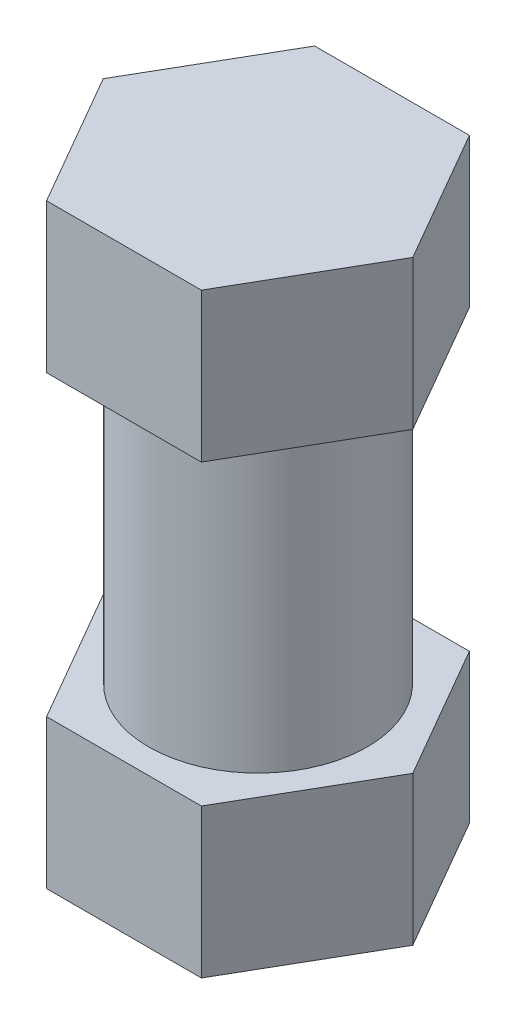
ISO-10303-21;
HEADER;
FILE_DESCRIPTION(('STEP AP214'),'2;1');
FILE_NAME('part.step','',(''),(''),'','','');
FILE_SCHEMA(('AUTOMOTIVE_DESIGN { 1 0 10303 214 1 1 1 1 }'));
ENDSEC;
DATA;
#1=APPLICATION_CONTEXT('core data for automotive mechanical design processes');
#2=APPLICATION_PROTOCOL_DEFINITION('international standard','automotive_design',2000,#1);
#3=PRODUCT_CONTEXT('',#1,'mechanical');
#4=PRODUCT('Part','Part','',(#3));
#5=PRODUCT_RELATED_PRODUCT_CATEGORY('part','',(#4));
#6=PRODUCT_DEFINITION_FORMATION('','',#4);
#7=PRODUCT_DEFINITION_CONTEXT('part definition',#1,'design');
#8=PRODUCT_DEFINITION('design','',#6,#7);
#9=PRODUCT_DEFINITION_SHAPE('','',#8);
#10=(LENGTH_UNIT() NAMED_UNIT(*) SI_UNIT(.MILLI.,.METRE.));
#11=(NAMED_UNIT(*) PLANE_ANGLE_UNIT() SI_UNIT($,.RADIAN.));
#12=(NAMED_UNIT(*) SI_UNIT($,.STERADIAN.) SOLID_ANGLE_UNIT());
#13=UNCERTAINTY_MEASURE_WITH_UNIT(LENGTH_MEASURE(1.E-05),#10,'distance_accuracy_value','');
#14=(GEOMETRIC_REPRESENTATION_CONTEXT(3) GLOBAL_UNCERTAINTY_ASSIGNED_CONTEXT((#13)) GLOBAL_UNIT_ASSIGNED_CONTEXT((#10,
#11,#12)) REPRESENTATION_CONTEXT('',''));
#15=CARTESIAN_POINT('',(0.,0.,0.));
#16=DIRECTION('',(0.,0.,1.));
#17=DIRECTION('',(1.,0.,0.));
#18=AXIS2_PLACEMENT_3D('',#15,#16,#17);
#19=CARTESIAN_POINT('',(0.,3.,0.));
#20=DIRECTION('',(0.,-1.,0.));
#21=DIRECTION('',(0.,0.,-1.));
#22=AXIS2_PLACEMENT_3D('',#19,#20,#21);
#23=CYLINDRICAL_SURFACE('',#22,2.2);
#24=CARTESIAN_POINT('',(0.,3.,0.));
#25=DIRECTION('',(0.,1.,0.));
#26=DIRECTION('',(0.,0.,1.));
#27=AXIS2_PLACEMENT_3D('',#24,#25,#26);
#28=CIRCLE('',#27,2.2);
#29=CARTESIAN_POINT('',(0.,3.,2.2));
#30=VERTEX_POINT('',#29);
#31=EDGE_CURVE('E11',#30,#30,#28,.T.);
#32=ORIENTED_EDGE('',*,*,#31,.F.);
#33=EDGE_LOOP('',(#32));
#34=FACE_BOUND('',#33,.T.);
#35=CARTESIAN_POINT('',(0.,-3.,0.));
#36=DIRECTION('',(0.,1.,0.));
#37=DIRECTION('',(0.,0.,1.));
#38=AXIS2_PLACEMENT_3D('',#35,#36,#37);
#39=CIRCLE('',#38,2.2);
#40=CARTESIAN_POINT('',(0.,-3.,2.2));
#41=VERTEX_POINT('',#40);
#42=EDGE_CURVE('E132',#41,#41,#39,.T.);
#43=ORIENTED_EDGE('',*,*,#42,.T.);
#44=EDGE_LOOP('',(#43));
#45=FACE_BOUND('',#44,.T.);
#46=ADVANCED_FACE('F39',(#34,#45),#23,.T.);
#47=CARTESIAN_POINT('',(1.55884572681199,6.,-2.7));
#48=DIRECTION('',(0.,0.,1.));
#49=DIRECTION('',(1.,0.,0.));
#50=AXIS2_PLACEMENT_3D('',#47,#48,#49);
#51=PLANE('',#50);
#52=DIRECTION('',(-1.,0.,0.));
#53=VECTOR('',#52,1.);
#54=CARTESIAN_POINT('',(1.55884572681199,3.,-2.7));
#55=LINE('',#54,#53);
#56=CARTESIAN_POINT('',(1.55884572681199,3.,-2.7));
#57=VERTEX_POINT('',#56);
#58=CARTESIAN_POINT('',(-1.55884572681199,3.,-2.7));
#59=VERTEX_POINT('',#58);
#60=EDGE_CURVE('E128',#57,#59,#55,.T.);
#61=ORIENTED_EDGE('',*,*,#60,.T.);
#62=DIRECTION('',(0.,-1.,0.));
#63=VECTOR('',#62,1.);
#64=CARTESIAN_POINT('',(-1.55884572681199,6.,-2.7));
#65=LINE('',#64,#63);
#66=CARTESIAN_POINT('',(-1.55884572681199,6.,-2.7));
#67=VERTEX_POINT('',#66);
#68=EDGE_CURVE('E47',#67,#59,#65,.T.);
#69=ORIENTED_EDGE('',*,*,#68,.F.);
#70=DIRECTION('',(-1.,0.,0.));
#71=VECTOR('',#70,1.);
#72=CARTESIAN_POINT('',(1.55884572681199,6.,-2.7));
#73=LINE('',#72,#71);
#74=CARTESIAN_POINT('',(1.55884572681199,6.,-2.7));
#75=VERTEX_POINT('',#74);
#76=EDGE_CURVE('E139',#75,#67,#73,.T.);
#77=ORIENTED_EDGE('',*,*,#76,.F.);
#78=DIRECTION('',(0.,-1.,0.));
#79=VECTOR('',#78,1.);
#80=CARTESIAN_POINT('',(1.55884572681199,6.,-2.7));
#81=LINE('',#80,#79);
#82=EDGE_CURVE('E124',#75,#57,#81,.T.);
#83=ORIENTED_EDGE('',*,*,#82,.T.);
#84=EDGE_LOOP('',(#61,#69,#77,#83));
#85=FACE_BOUND('',#84,.T.);
#86=ADVANCED_FACE('F150',(#85),#51,.F.);
#87=CARTESIAN_POINT('',(-1.55884572681199,6.,-2.7));
#88=DIRECTION('',(0.866025403784439,0.,0.5));
#89=DIRECTION('',(0.5,0.,-0.866025403784439));
#90=AXIS2_PLACEMENT_3D('',#87,#88,#89);
#91=PLANE('',#90);
#92=DIRECTION('',(-0.5,0.,0.866025403784439));
#93=VECTOR('',#92,1.);
#94=CARTESIAN_POINT('',(-1.55884572681199,3.,-2.7));
#95=LINE('',#94,#93);
#96=CARTESIAN_POINT('',(-3.11769145362398,3.,0.));
#97=VERTEX_POINT('',#96);
#98=EDGE_CURVE('E131',#59,#97,#95,.T.);
#99=ORIENTED_EDGE('',*,*,#98,.T.);
#100=DIRECTION('',(0.,-1.,0.));
#101=VECTOR('',#100,1.);
#102=CARTESIAN_POINT('',(-3.11769145362398,6.,0.));
#103=LINE('',#102,#101);
#104=CARTESIAN_POINT('',(-3.11769145362398,6.,0.));
#105=VERTEX_POINT('',#104);
#106=EDGE_CURVE('E143',#105,#97,#103,.T.);
#107=ORIENTED_EDGE('',*,*,#106,.F.);
#108=DIRECTION('',(-0.5,0.,0.866025403784439));
#109=VECTOR('',#108,1.);
#110=CARTESIAN_POINT('',(-1.55884572681199,6.,-2.7));
#111=LINE('',#110,#109);
#112=EDGE_CURVE('E94',#67,#105,#111,.T.);
#113=ORIENTED_EDGE('',*,*,#112,.F.);
#114=ORIENTED_EDGE('',*,*,#68,.T.);
#115=EDGE_LOOP('',(#99,#107,#113,#114));
#116=FACE_BOUND('',#115,.T.);
#117=ADVANCED_FACE('F146',(#116),#91,.F.);
#118=CARTESIAN_POINT('',(-3.11769145362398,6.,0.));
#119=DIRECTION('',(0.866025403784439,0.,-0.5));
#120=DIRECTION('',(-0.5,0.,-0.866025403784439));
#121=AXIS2_PLACEMENT_3D('',#118,#119,#120);
#122=PLANE('',#121);
#123=DIRECTION('',(0.5,0.,0.866025403784439));
#124=VECTOR('',#123,1.);
#125=CARTESIAN_POINT('',(-3.11769145362398,3.,0.));
#126=LINE('',#125,#124);
#127=CARTESIAN_POINT('',(-1.55884572681199,3.,2.7));
#128=VERTEX_POINT('',#127);
#129=EDGE_CURVE('E134',#97,#128,#126,.T.);
#130=ORIENTED_EDGE('',*,*,#129,.T.);
#131=DIRECTION('',(0.,-1.,0.));
#132=VECTOR('',#131,1.);
#133=CARTESIAN_POINT('',(-1.55884572681199,6.,2.7));
#134=LINE('',#133,#132);
#135=CARTESIAN_POINT('',(-1.55884572681199,6.,2.7));
#136=VERTEX_POINT('',#135);
#137=EDGE_CURVE('E119',#136,#128,#134,.T.);
#138=ORIENTED_EDGE('',*,*,#137,.F.);
#139=DIRECTION('',(0.5,0.,0.866025403784439));
#140=VECTOR('',#139,1.);
#141=CARTESIAN_POINT('',(-3.11769145362398,6.,0.));
#142=LINE('',#141,#140);
#143=EDGE_CURVE('E110',#105,#136,#142,.T.);
#144=ORIENTED_EDGE('',*,*,#143,.F.);
#145=ORIENTED_EDGE('',*,*,#106,.T.);
#146=EDGE_LOOP('',(#130,#138,#144,#145));
#147=FACE_BOUND('',#146,.T.);
#148=ADVANCED_FACE('F155',(#147),#122,.F.);
#149=CARTESIAN_POINT('',(-1.55884572681199,6.,2.7));
#150=DIRECTION('',(0.,0.,-1.));
#151=DIRECTION('',(-1.,0.,0.));
#152=AXIS2_PLACEMENT_3D('',#149,#150,#151);
#153=PLANE('',#152);
#154=DIRECTION('',(1.,0.,0.));
#155=VECTOR('',#154,1.);
#156=CARTESIAN_POINT('',(-1.55884572681199,3.,2.7));
#157=LINE('',#156,#155);
#158=CARTESIAN_POINT('',(1.55884572681199,3.,2.7));
#159=VERTEX_POINT('',#158);
#160=EDGE_CURVE('E118',#128,#159,#157,.T.);
#161=ORIENTED_EDGE('',*,*,#160,.T.);
#162=DIRECTION('',(0.,-1.,0.));
#163=VECTOR('',#162,1.);
#164=CARTESIAN_POINT('',(1.55884572681199,6.,2.7));
#165=LINE('',#164,#163);
#166=CARTESIAN_POINT('',(1.55884572681199,6.,2.7));
#167=VERTEX_POINT('',#166);
#168=EDGE_CURVE('E115',#167,#159,#165,.T.);
#169=ORIENTED_EDGE('',*,*,#168,.F.);
#170=DIRECTION('',(1.,0.,0.));
#171=VECTOR('',#170,1.);
#172=CARTESIAN_POINT('',(-1.55884572681199,6.,2.7));
#173=LINE('',#172,#171);
#174=EDGE_CURVE('E104',#136,#167,#173,.T.);
#175=ORIENTED_EDGE('',*,*,#174,.F.);
#176=ORIENTED_EDGE('',*,*,#137,.T.);
#177=EDGE_LOOP('',(#161,#169,#175,#176));
#178=FACE_BOUND('',#177,.T.);
#179=ADVANCED_FACE('F116',(#178),#153,.F.);
#180=CARTESIAN_POINT('',(1.55884572681199,6.,2.7));
#181=DIRECTION('',(-0.866025403784439,0.,-0.5));
#182=DIRECTION('',(-0.5,0.,0.866025403784439));
#183=AXIS2_PLACEMENT_3D('',#180,#181,#182);
#184=PLANE('',#183);
#185=DIRECTION('',(0.5,0.,-0.866025403784439));
#186=VECTOR('',#185,1.);
#187=CARTESIAN_POINT('',(1.55884572681199,3.,2.7));
#188=LINE('',#187,#186);
#189=CARTESIAN_POINT('',(3.11769145362398,3.,0.));
#190=VERTEX_POINT('',#189);
#191=EDGE_CURVE('E79',#159,#190,#188,.T.);
#192=ORIENTED_EDGE('',*,*,#191,.T.);
#193=DIRECTION('',(0.,-1.,0.));
#194=VECTOR('',#193,1.);
#195=CARTESIAN_POINT('',(3.11769145362398,6.,0.));
#196=LINE('',#195,#194);
#197=CARTESIAN_POINT('',(3.11769145362398,6.,0.));
#198=VERTEX_POINT('',#197);
#199=EDGE_CURVE('E120',#198,#190,#196,.T.);
#200=ORIENTED_EDGE('',*,*,#199,.F.);
#201=DIRECTION('',(0.5,0.,-0.866025403784439));
#202=VECTOR('',#201,1.);
#203=CARTESIAN_POINT('',(1.55884572681199,6.,2.7));
#204=LINE('',#203,#202);
#205=EDGE_CURVE('E108',#167,#198,#204,.T.);
#206=ORIENTED_EDGE('',*,*,#205,.F.);
#207=ORIENTED_EDGE('',*,*,#168,.T.);
#208=EDGE_LOOP('',(#192,#200,#206,#207));
#209=FACE_BOUND('',#208,.T.);
#210=ADVANCED_FACE('F122',(#209),#184,.F.);
#211=CARTESIAN_POINT('',(3.11769145362398,6.,0.));
#212=DIRECTION('',(-0.866025403784439,0.,0.5));
#213=DIRECTION('',(0.5,0.,0.866025403784439));
#214=AXIS2_PLACEMENT_3D('',#211,#212,#213);
#215=PLANE('',#214);
#216=DIRECTION('',(-0.5,0.,-0.866025403784439));
#217=VECTOR('',#216,1.);
#218=CARTESIAN_POINT('',(3.11769145362398,3.,0.));
#219=LINE('',#218,#217);
#220=EDGE_CURVE('E85',#190,#57,#219,.T.);
#221=ORIENTED_EDGE('',*,*,#220,.T.);
#222=ORIENTED_EDGE('',*,*,#82,.F.);
#223=DIRECTION('',(-0.5,0.,-0.866025403784439));
#224=VECTOR('',#223,1.);
#225=CARTESIAN_POINT('',(3.11769145362398,6.,0.));
#226=LINE('',#225,#224);
#227=EDGE_CURVE('E55',#198,#75,#226,.T.);
#228=ORIENTED_EDGE('',*,*,#227,.F.);
#229=ORIENTED_EDGE('',*,*,#199,.T.);
#230=EDGE_LOOP('',(#221,#222,#228,#229));
#231=FACE_BOUND('',#230,.T.);
#232=ADVANCED_FACE('F353',(#231),#215,.F.);
#233=CARTESIAN_POINT('',(0.,6.,0.));
#234=DIRECTION('',(0.,1.,0.));
#235=DIRECTION('',(0.,0.,1.));
#236=AXIS2_PLACEMENT_3D('',#233,#234,#235);
#237=PLANE('',#236);
#238=ORIENTED_EDGE('',*,*,#76,.T.);
#239=ORIENTED_EDGE('',*,*,#112,.T.);
#240=ORIENTED_EDGE('',*,*,#143,.T.);
#241=ORIENTED_EDGE('',*,*,#174,.T.);
#242=ORIENTED_EDGE('',*,*,#205,.T.);
#243=ORIENTED_EDGE('',*,*,#227,.T.);
#244=EDGE_LOOP('',(#238,#239,#240,#241,#242,#243));
#245=FACE_BOUND('',#244,.T.);
#246=ADVANCED_FACE('F106',(#245),#237,.T.);
#247=CARTESIAN_POINT('',(0.,3.,0.));
#248=DIRECTION('',(0.,1.,0.));
#249=DIRECTION('',(0.,0.,1.));
#250=AXIS2_PLACEMENT_3D('',#247,#248,#249);
#251=PLANE('',#250);
#252=ORIENTED_EDGE('',*,*,#31,.T.);
#253=EDGE_LOOP('',(#252));
#254=FACE_BOUND('',#253,.T.);
#255=ORIENTED_EDGE('',*,*,#60,.F.);
#256=ORIENTED_EDGE('',*,*,#220,.F.);
#257=ORIENTED_EDGE('',*,*,#191,.F.);
#258=ORIENTED_EDGE('',*,*,#160,.F.);
#259=ORIENTED_EDGE('',*,*,#129,.F.);
#260=ORIENTED_EDGE('',*,*,#98,.F.);
#261=EDGE_LOOP('',(#255,#256,#257,#258,#259,#260));
#262=FACE_BOUND('',#261,.T.);
#263=ADVANCED_FACE('F152',(#254,#262),#251,.F.);
#264=CARTESIAN_POINT('',(1.55884572681199,-6.,-2.7));
#265=DIRECTION('',(0.,0.,-1.));
#266=DIRECTION('',(-1.,0.,0.));
#267=AXIS2_PLACEMENT_3D('',#264,#265,#266);
#268=PLANE('',#267);
#269=DIRECTION('',(-1.,0.,0.));
#270=VECTOR('',#269,1.);
#271=CARTESIAN_POINT('',(1.55884572681199,-3.,-2.7));
#272=LINE('',#271,#270);
#273=CARTESIAN_POINT('',(1.55884572681199,-3.,-2.7));
#274=VERTEX_POINT('',#273);
#275=CARTESIAN_POINT('',(-1.55884572681199,-3.,-2.7));
#276=VERTEX_POINT('',#275);
#277=EDGE_CURVE('E196',#274,#276,#272,.T.);
#278=ORIENTED_EDGE('',*,*,#277,.F.);
#279=DIRECTION('',(0.,1.,0.));
#280=VECTOR('',#279,1.);
#281=CARTESIAN_POINT('',(1.55884572681199,-6.,-2.7));
#282=LINE('',#281,#280);
#283=CARTESIAN_POINT('',(1.55884572681199,-6.,-2.7));
#284=VERTEX_POINT('',#283);
#285=EDGE_CURVE('E161',#284,#274,#282,.T.);
#286=ORIENTED_EDGE('',*,*,#285,.F.);
#287=DIRECTION('',(-1.,0.,0.));
#288=VECTOR('',#287,1.);
#289=CARTESIAN_POINT('',(1.55884572681199,-6.,-2.7));
#290=LINE('',#289,#288);
#291=CARTESIAN_POINT('',(-1.55884572681199,-6.,-2.7));
#292=VERTEX_POINT('',#291);
#293=EDGE_CURVE('E183',#284,#292,#290,.T.);
#294=ORIENTED_EDGE('',*,*,#293,.T.);
#295=DIRECTION('',(0.,1.,0.));
#296=VECTOR('',#295,1.);
#297=CARTESIAN_POINT('',(-1.55884572681199,-6.,-2.7));
#298=LINE('',#297,#296);
#299=EDGE_CURVE('E176',#292,#276,#298,.T.);
#300=ORIENTED_EDGE('',*,*,#299,.T.);
#301=EDGE_LOOP('',(#278,#286,#294,#300));
#302=FACE_BOUND('',#301,.T.);
#303=ADVANCED_FACE('F219',(#302),#268,.T.);
#304=CARTESIAN_POINT('',(3.11769145362398,-6.,0.));
#305=DIRECTION('',(0.866025403784439,0.,-0.5));
#306=DIRECTION('',(-0.5,0.,-0.866025403784439));
#307=AXIS2_PLACEMENT_3D('',#304,#305,#306);
#308=PLANE('',#307);
#309=DIRECTION('',(-0.5,0.,-0.866025403784439));
#310=VECTOR('',#309,1.);
#311=CARTESIAN_POINT('',(3.11769145362398,-3.,0.));
#312=LINE('',#311,#310);
#313=CARTESIAN_POINT('',(3.11769145362398,-3.,0.));
#314=VERTEX_POINT('',#313);
#315=EDGE_CURVE('E193',#314,#274,#312,.T.);
#316=ORIENTED_EDGE('',*,*,#315,.F.);
#317=DIRECTION('',(0.,1.,0.));
#318=VECTOR('',#317,1.);
#319=CARTESIAN_POINT('',(3.11769145362398,-6.,0.));
#320=LINE('',#319,#318);
#321=CARTESIAN_POINT('',(3.11769145362398,-6.,0.));
#322=VERTEX_POINT('',#321);
#323=EDGE_CURVE('E164',#322,#314,#320,.T.);
#324=ORIENTED_EDGE('',*,*,#323,.F.);
#325=DIRECTION('',(-0.5,0.,-0.866025403784439));
#326=VECTOR('',#325,1.);
#327=CARTESIAN_POINT('',(3.11769145362398,-6.,0.));
#328=LINE('',#327,#326);
#329=EDGE_CURVE('E210',#322,#284,#328,.T.);
#330=ORIENTED_EDGE('',*,*,#329,.T.);
#331=ORIENTED_EDGE('',*,*,#285,.T.);
#332=EDGE_LOOP('',(#316,#324,#330,#331));
#333=FACE_BOUND('',#332,.T.);
#334=ADVANCED_FACE('F267',(#333),#308,.T.);
#335=CARTESIAN_POINT('',(1.55884572681199,-6.,2.7));
#336=DIRECTION('',(0.866025403784439,0.,0.5));
#337=DIRECTION('',(0.5,0.,-0.866025403784439));
#338=AXIS2_PLACEMENT_3D('',#335,#336,#337);
#339=PLANE('',#338);
#340=DIRECTION('',(0.5,0.,-0.866025403784439));
#341=VECTOR('',#340,1.);
#342=CARTESIAN_POINT('',(1.55884572681199,-3.,2.7));
#343=LINE('',#342,#341);
#344=CARTESIAN_POINT('',(1.55884572681199,-3.,2.7));
#345=VERTEX_POINT('',#344);
#346=EDGE_CURVE('E190',#345,#314,#343,.T.);
#347=ORIENTED_EDGE('',*,*,#346,.F.);
#348=DIRECTION('',(0.,1.,0.));
#349=VECTOR('',#348,1.);
#350=CARTESIAN_POINT('',(1.55884572681199,-6.,2.7));
#351=LINE('',#350,#349);
#352=CARTESIAN_POINT('',(1.55884572681199,-6.,2.7));
#353=VERTEX_POINT('',#352);
#354=EDGE_CURVE('E167',#353,#345,#351,.T.);
#355=ORIENTED_EDGE('',*,*,#354,.F.);
#356=DIRECTION('',(0.5,0.,-0.866025403784439));
#357=VECTOR('',#356,1.);
#358=CARTESIAN_POINT('',(1.55884572681199,-6.,2.7));
#359=LINE('',#358,#357);
#360=EDGE_CURVE('E207',#353,#322,#359,.T.);
#361=ORIENTED_EDGE('',*,*,#360,.T.);
#362=ORIENTED_EDGE('',*,*,#323,.T.);
#363=EDGE_LOOP('',(#347,#355,#361,#362));
#364=FACE_BOUND('',#363,.T.);
#365=ADVANCED_FACE('F258',(#364),#339,.T.);
#366=CARTESIAN_POINT('',(-1.55884572681199,-6.,2.7));
#367=DIRECTION('',(0.,0.,1.));
#368=DIRECTION('',(1.,0.,0.));
#369=AXIS2_PLACEMENT_3D('',#366,#367,#368);
#370=PLANE('',#369);
#371=DIRECTION('',(1.,0.,0.));
#372=VECTOR('',#371,1.);
#373=CARTESIAN_POINT('',(-1.55884572681199,-3.,2.7));
#374=LINE('',#373,#372);
#375=CARTESIAN_POINT('',(-1.55884572681199,-3.,2.7));
#376=VERTEX_POINT('',#375);
#377=EDGE_CURVE('E187',#376,#345,#374,.T.);
#378=ORIENTED_EDGE('',*,*,#377,.F.);
#379=DIRECTION('',(0.,1.,0.));
#380=VECTOR('',#379,1.);
#381=CARTESIAN_POINT('',(-1.55884572681199,-6.,2.7));
#382=LINE('',#381,#380);
#383=CARTESIAN_POINT('',(-1.55884572681199,-6.,2.7));
#384=VERTEX_POINT('',#383);
#385=EDGE_CURVE('E170',#384,#376,#382,.T.);
#386=ORIENTED_EDGE('',*,*,#385,.F.);
#387=DIRECTION('',(1.,0.,0.));
#388=VECTOR('',#387,1.);
#389=CARTESIAN_POINT('',(-1.55884572681199,-6.,2.7));
#390=LINE('',#389,#388);
#391=EDGE_CURVE('E204',#384,#353,#390,.T.);
#392=ORIENTED_EDGE('',*,*,#391,.T.);
#393=ORIENTED_EDGE('',*,*,#354,.T.);
#394=EDGE_LOOP('',(#378,#386,#392,#393));
#395=FACE_BOUND('',#394,.T.);
#396=ADVANCED_FACE('F261',(#395),#370,.T.);
#397=CARTESIAN_POINT('',(-3.11769145362398,-6.,0.));
#398=DIRECTION('',(-0.866025403784439,0.,0.5));
#399=DIRECTION('',(0.5,0.,0.866025403784439));
#400=AXIS2_PLACEMENT_3D('',#397,#398,#399);
#401=PLANE('',#400);
#402=DIRECTION('',(0.5,0.,0.866025403784439));
#403=VECTOR('',#402,1.);
#404=CARTESIAN_POINT('',(-3.11769145362398,-3.,0.));
#405=LINE('',#404,#403);
#406=CARTESIAN_POINT('',(-3.11769145362398,-3.,0.));
#407=VERTEX_POINT('',#406);
#408=EDGE_CURVE('E184',#407,#376,#405,.T.);
#409=ORIENTED_EDGE('',*,*,#408,.F.);
#410=DIRECTION('',(0.,1.,0.));
#411=VECTOR('',#410,1.);
#412=CARTESIAN_POINT('',(-3.11769145362398,-6.,0.));
#413=LINE('',#412,#411);
#414=CARTESIAN_POINT('',(-3.11769145362398,-6.,0.));
#415=VERTEX_POINT('',#414);
#416=EDGE_CURVE('E173',#415,#407,#413,.T.);
#417=ORIENTED_EDGE('',*,*,#416,.F.);
#418=DIRECTION('',(0.5,0.,0.866025403784439));
#419=VECTOR('',#418,1.);
#420=CARTESIAN_POINT('',(-3.11769145362398,-6.,0.));
#421=LINE('',#420,#419);
#422=EDGE_CURVE('E201',#415,#384,#421,.T.);
#423=ORIENTED_EDGE('',*,*,#422,.T.);
#424=ORIENTED_EDGE('',*,*,#385,.T.);
#425=EDGE_LOOP('',(#409,#417,#423,#424));
#426=FACE_BOUND('',#425,.T.);
#427=ADVANCED_FACE('F262',(#426),#401,.T.);
#428=CARTESIAN_POINT('',(-1.55884572681199,-6.,-2.7));
#429=DIRECTION('',(-0.866025403784439,0.,-0.5));
#430=DIRECTION('',(-0.5,0.,0.866025403784439));
#431=AXIS2_PLACEMENT_3D('',#428,#429,#430);
#432=PLANE('',#431);
#433=DIRECTION('',(-0.5,0.,0.866025403784439));
#434=VECTOR('',#433,1.);
#435=CARTESIAN_POINT('',(-1.55884572681199,-3.,-2.7));
#436=LINE('',#435,#434);
#437=EDGE_CURVE('E180',#276,#407,#436,.T.);
#438=ORIENTED_EDGE('',*,*,#437,.F.);
#439=ORIENTED_EDGE('',*,*,#299,.F.);
#440=DIRECTION('',(-0.5,0.,0.866025403784439));
#441=VECTOR('',#440,1.);
#442=CARTESIAN_POINT('',(-1.55884572681199,-6.,-2.7));
#443=LINE('',#442,#441);
#444=EDGE_CURVE('E179',#292,#415,#443,.T.);
#445=ORIENTED_EDGE('',*,*,#444,.T.);
#446=ORIENTED_EDGE('',*,*,#416,.T.);
#447=EDGE_LOOP('',(#438,#439,#445,#446));
#448=FACE_BOUND('',#447,.T.);
#449=ADVANCED_FACE('F231',(#448),#432,.T.);
#450=CARTESIAN_POINT('',(0.,-6.,0.));
#451=DIRECTION('',(0.,-1.,0.));
#452=DIRECTION('',(0.,0.,1.));
#453=AXIS2_PLACEMENT_3D('',#450,#451,#452);
#454=PLANE('',#453);
#455=ORIENTED_EDGE('',*,*,#293,.F.);
#456=ORIENTED_EDGE('',*,*,#329,.F.);
#457=ORIENTED_EDGE('',*,*,#360,.F.);
#458=ORIENTED_EDGE('',*,*,#391,.F.);
#459=ORIENTED_EDGE('',*,*,#422,.F.);
#460=ORIENTED_EDGE('',*,*,#444,.F.);
#461=EDGE_LOOP('',(#455,#456,#457,#458,#459,#460));
#462=FACE_BOUND('',#461,.T.);
#463=ADVANCED_FACE('F227',(#462),#454,.T.);
#464=CARTESIAN_POINT('',(0.,-3.,0.));
#465=DIRECTION('',(0.,-1.,0.));
#466=DIRECTION('',(0.,0.,1.));
#467=AXIS2_PLACEMENT_3D('',#464,#465,#466);
#468=PLANE('',#467);
#469=ORIENTED_EDGE('',*,*,#42,.F.);
#470=EDGE_LOOP('',(#469));
#471=FACE_BOUND('',#470,.T.);
#472=ORIENTED_EDGE('',*,*,#277,.T.);
#473=ORIENTED_EDGE('',*,*,#437,.T.);
#474=ORIENTED_EDGE('',*,*,#408,.T.);
#475=ORIENTED_EDGE('',*,*,#377,.T.);
#476=ORIENTED_EDGE('',*,*,#346,.T.);
#477=ORIENTED_EDGE('',*,*,#315,.T.);
#478=EDGE_LOOP('',(#472,#473,#474,#475,#476,#477));
#479=FACE_BOUND('',#478,.T.);
#480=ADVANCED_FACE('F264',(#471,#479),#468,.F.);
#481=CLOSED_SHELL('',(#46,#86,#117,#148,#179,#210,#232,#246,#263,#303,#334,#365,#396,#427,#449,
#463,#480));
#482=MANIFOLD_SOLID_BREP('B2',#481);
#483=ADVANCED_BREP_SHAPE_REPRESENTATION('',(#18,#482),#14);
#484=SHAPE_DEFINITION_REPRESENTATION(#9,#483);
ENDSEC;
END-ISO-10303-21;
